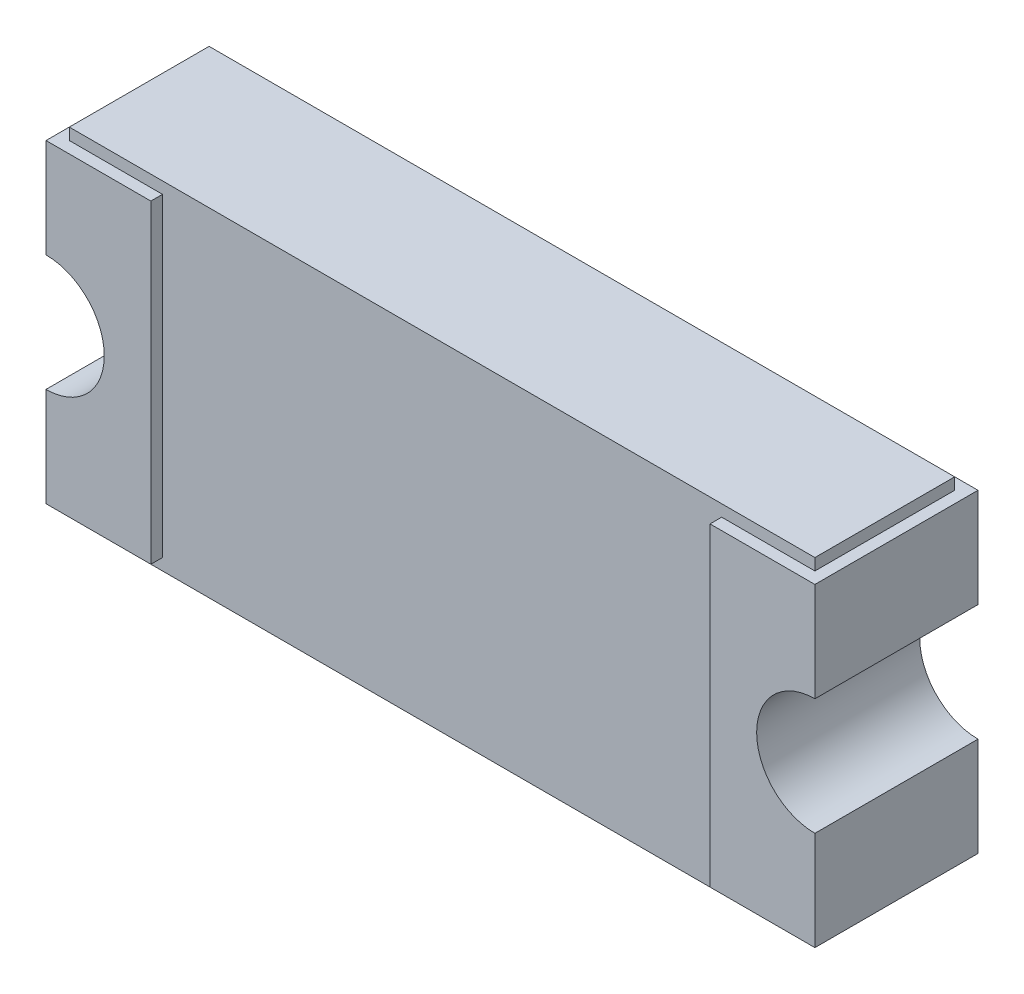
ISO-10303-21;
HEADER;
FILE_DESCRIPTION(('STEP AP214'),'2;1');
FILE_NAME('part.step','',(''),(''),'','','');
FILE_SCHEMA(('AUTOMOTIVE_DESIGN { 1 0 10303 214 1 1 1 1 }'));
ENDSEC;
DATA;
#1=APPLICATION_CONTEXT('core data for automotive mechanical design processes');
#2=APPLICATION_PROTOCOL_DEFINITION('international standard','automotive_design',2000,#1);
#3=PRODUCT_CONTEXT('',#1,'mechanical');
#4=PRODUCT('Part','Part','',(#3));
#5=PRODUCT_RELATED_PRODUCT_CATEGORY('part','',(#4));
#6=PRODUCT_DEFINITION_FORMATION('','',#4);
#7=PRODUCT_DEFINITION_CONTEXT('part definition',#1,'design');
#8=PRODUCT_DEFINITION('design','',#6,#7);
#9=PRODUCT_DEFINITION_SHAPE('','',#8);
#10=(LENGTH_UNIT() NAMED_UNIT(*) SI_UNIT(.MILLI.,.METRE.));
#11=(NAMED_UNIT(*) PLANE_ANGLE_UNIT() SI_UNIT($,.RADIAN.));
#12=(NAMED_UNIT(*) SI_UNIT($,.STERADIAN.) SOLID_ANGLE_UNIT());
#13=UNCERTAINTY_MEASURE_WITH_UNIT(LENGTH_MEASURE(1.E-05),#10,'distance_accuracy_value','');
#14=(GEOMETRIC_REPRESENTATION_CONTEXT(3) GLOBAL_UNCERTAINTY_ASSIGNED_CONTEXT((#13)) GLOBAL_UNIT_ASSIGNED_CONTEXT((#10,
#11,#12)) REPRESENTATION_CONTEXT('',''));
#15=CARTESIAN_POINT('',(0.,0.,0.));
#16=DIRECTION('',(0.,0.,1.));
#17=DIRECTION('',(1.,0.,0.));
#18=AXIS2_PLACEMENT_3D('',#15,#16,#17);
#19=CARTESIAN_POINT('',(-0.825,0.,0.35));
#20=DIRECTION('',(0.,0.,1.));
#21=DIRECTION('',(1.,0.,0.));
#22=AXIS2_PLACEMENT_3D('',#19,#20,#21);
#23=CYLINDRICAL_SURFACE('',#22,0.125);
#24=CARTESIAN_POINT('',(-0.825,0.,0.35));
#25=DIRECTION('',(0.,0.,1.));
#26=DIRECTION('',(1.,0.,0.));
#27=AXIS2_PLACEMENT_3D('',#24,#25,#26);
#28=CIRCLE('',#27,0.125);
#29=CARTESIAN_POINT('',(-0.825,-0.125,0.35));
#30=VERTEX_POINT('',#29);
#31=CARTESIAN_POINT('',(-0.825,0.125,0.35));
#32=VERTEX_POINT('',#31);
#33=EDGE_CURVE('E191',#30,#32,#28,.T.);
#34=ORIENTED_EDGE('',*,*,#33,.T.);
#35=DIRECTION('',(0.,0.,1.));
#36=VECTOR('',#35,1.);
#37=CARTESIAN_POINT('',(-0.825,0.125,0.));
#38=LINE('',#37,#36);
#39=CARTESIAN_POINT('',(-0.825,0.125,0.));
#40=VERTEX_POINT('',#39);
#41=EDGE_CURVE('E175',#40,#32,#38,.T.);
#42=ORIENTED_EDGE('',*,*,#41,.F.);
#43=CARTESIAN_POINT('',(-0.825,0.,0.));
#44=DIRECTION('',(0.,0.,1.));
#45=DIRECTION('',(1.,0.,0.));
#46=AXIS2_PLACEMENT_3D('',#43,#44,#45);
#47=CIRCLE('',#46,0.125);
#48=CARTESIAN_POINT('',(-0.825,-0.125,0.));
#49=VERTEX_POINT('',#48);
#50=EDGE_CURVE('E20',#40,#49,#47,.F.);
#51=ORIENTED_EDGE('',*,*,#50,.T.);
#52=DIRECTION('',(0.,0.,1.));
#53=VECTOR('',#52,1.);
#54=CARTESIAN_POINT('',(-0.825,-0.125,0.));
#55=LINE('',#54,#53);
#56=EDGE_CURVE('E179',#30,#49,#55,.F.);
#57=ORIENTED_EDGE('',*,*,#56,.F.);
#58=EDGE_LOOP('',(#34,#42,#51,#57));
#59=FACE_BOUND('',#58,.T.);
#60=ADVANCED_FACE('F17',(#59),#23,.F.);
#61=CARTESIAN_POINT('',(0.825,0.,0.35));
#62=DIRECTION('',(0.,0.,1.));
#63=DIRECTION('',(1.,0.,0.));
#64=AXIS2_PLACEMENT_3D('',#61,#62,#63);
#65=CYLINDRICAL_SURFACE('',#64,0.125);
#66=CARTESIAN_POINT('',(0.825,0.,0.35));
#67=DIRECTION('',(0.,0.,1.));
#68=DIRECTION('',(1.,0.,0.));
#69=AXIS2_PLACEMENT_3D('',#66,#67,#68);
#70=CIRCLE('',#69,0.125);
#71=CARTESIAN_POINT('',(0.825,0.125,0.35));
#72=VERTEX_POINT('',#71);
#73=CARTESIAN_POINT('',(0.825,-0.125,0.35));
#74=VERTEX_POINT('',#73);
#75=EDGE_CURVE('E311',#72,#74,#70,.T.);
#76=ORIENTED_EDGE('',*,*,#75,.T.);
#77=DIRECTION('',(0.,0.,-1.));
#78=VECTOR('',#77,1.);
#79=CARTESIAN_POINT('',(0.825,-0.125,0.));
#80=LINE('',#79,#78);
#81=CARTESIAN_POINT('',(0.825,-0.125,0.));
#82=VERTEX_POINT('',#81);
#83=EDGE_CURVE('E291',#82,#74,#80,.F.);
#84=ORIENTED_EDGE('',*,*,#83,.F.);
#85=CARTESIAN_POINT('',(0.825,0.,0.));
#86=DIRECTION('',(0.,0.,1.));
#87=DIRECTION('',(1.,0.,0.));
#88=AXIS2_PLACEMENT_3D('',#85,#86,#87);
#89=CIRCLE('',#88,0.125);
#90=CARTESIAN_POINT('',(0.825,0.125,0.));
#91=VERTEX_POINT('',#90);
#92=EDGE_CURVE('E336',#82,#91,#89,.F.);
#93=ORIENTED_EDGE('',*,*,#92,.T.);
#94=DIRECTION('',(0.,0.,-1.));
#95=VECTOR('',#94,1.);
#96=CARTESIAN_POINT('',(0.825,0.125,0.));
#97=LINE('',#96,#95);
#98=EDGE_CURVE('E308',#72,#91,#97,.T.);
#99=ORIENTED_EDGE('',*,*,#98,.F.);
#100=EDGE_LOOP('',(#76,#84,#93,#99));
#101=FACE_BOUND('',#100,.T.);
#102=ADVANCED_FACE('F563',(#101),#65,.F.);
#103=CARTESIAN_POINT('',(-0.825,0.3625,0.));
#104=DIRECTION('',(-1.,0.,0.));
#105=DIRECTION('',(0.,0.,1.));
#106=AXIS2_PLACEMENT_3D('',#103,#104,#105);
#107=PLANE('',#106);
#108=DIRECTION('',(0.,1.,0.));
#109=VECTOR('',#108,1.);
#110=CARTESIAN_POINT('',(-0.825,0.,0.));
#111=LINE('',#110,#109);
#112=CARTESIAN_POINT('',(-0.825,0.3375,0.));
#113=VERTEX_POINT('',#112);
#114=EDGE_CURVE('E185',#113,#40,#111,.F.);
#115=ORIENTED_EDGE('',*,*,#114,.T.);
#116=ORIENTED_EDGE('',*,*,#41,.T.);
#117=DIRECTION('',(0.,1.,0.));
#118=VECTOR('',#117,1.);
#119=CARTESIAN_POINT('',(-0.825,-0.3625,0.35));
#120=LINE('',#119,#118);
#121=CARTESIAN_POINT('',(-0.825,0.3375,0.35));
#122=VERTEX_POINT('',#121);
#123=EDGE_CURVE('E372',#32,#122,#120,.T.);
#124=ORIENTED_EDGE('',*,*,#123,.T.);
#125=DIRECTION('',(0.,0.,-1.));
#126=VECTOR('',#125,1.);
#127=CARTESIAN_POINT('',(-0.825,0.3375,0.68));
#128=LINE('',#127,#126);
#129=EDGE_CURVE('E229',#122,#113,#128,.T.);
#130=ORIENTED_EDGE('',*,*,#129,.T.);
#131=EDGE_LOOP('',(#115,#116,#124,#130));
#132=FACE_BOUND('',#131,.T.);
#133=ADVANCED_FACE('F561',(#132),#107,.T.);
#134=CARTESIAN_POINT('',(0.,0.,0.));
#135=DIRECTION('',(0.,0.,1.));
#136=DIRECTION('',(1.,0.,0.));
#137=AXIS2_PLACEMENT_3D('',#134,#135,#136);
#138=PLANE('',#137);
#139=ORIENTED_EDGE('',*,*,#50,.F.);
#140=ORIENTED_EDGE('',*,*,#114,.F.);
#141=DIRECTION('',(1.,0.,0.));
#142=VECTOR('',#141,1.);
#143=CARTESIAN_POINT('',(0.575,0.3375,0.));
#144=LINE('',#143,#142);
#145=CARTESIAN_POINT('',(-0.6,0.3375,0.));
#146=VERTEX_POINT('',#145);
#147=EDGE_CURVE('E225',#113,#146,#144,.T.);
#148=ORIENTED_EDGE('',*,*,#147,.T.);
#149=DIRECTION('',(0.,1.,0.));
#150=VECTOR('',#149,1.);
#151=CARTESIAN_POINT('',(-0.6,-0.3625,0.));
#152=LINE('',#151,#150);
#153=CARTESIAN_POINT('',(-0.6,-0.3375,0.));
#154=VERTEX_POINT('',#153);
#155=EDGE_CURVE('E206',#146,#154,#152,.F.);
#156=ORIENTED_EDGE('',*,*,#155,.T.);
#157=DIRECTION('',(1.,0.,0.));
#158=VECTOR('',#157,1.);
#159=CARTESIAN_POINT('',(0.825,-0.3375,0.));
#160=LINE('',#159,#158);
#161=CARTESIAN_POINT('',(-0.825,-0.3375,0.));
#162=VERTEX_POINT('',#161);
#163=EDGE_CURVE('E196',#154,#162,#160,.F.);
#164=ORIENTED_EDGE('',*,*,#163,.T.);
#165=DIRECTION('',(0.,1.,0.));
#166=VECTOR('',#165,1.);
#167=CARTESIAN_POINT('',(-0.825,0.3625,0.));
#168=LINE('',#167,#166);
#169=EDGE_CURVE('E184',#49,#162,#168,.F.);
#170=ORIENTED_EDGE('',*,*,#169,.F.);
#171=EDGE_LOOP('',(#139,#140,#148,#156,#164,#170));
#172=FACE_BOUND('',#171,.T.);
#173=ADVANCED_FACE('F194',(#172),#138,.F.);
#174=CARTESIAN_POINT('',(-0.825,0.3625,0.));
#175=DIRECTION('',(-1.,0.,0.));
#176=DIRECTION('',(0.,0.,1.));
#177=AXIS2_PLACEMENT_3D('',#174,#175,#176);
#178=PLANE('',#177);
#179=DIRECTION('',(0.,1.,0.));
#180=VECTOR('',#179,1.);
#181=CARTESIAN_POINT('',(-0.825,-0.3625,0.35));
#182=LINE('',#181,#180);
#183=CARTESIAN_POINT('',(-0.825,-0.3375,0.35));
#184=VERTEX_POINT('',#183);
#185=EDGE_CURVE('E190',#184,#30,#182,.T.);
#186=ORIENTED_EDGE('',*,*,#185,.T.);
#187=ORIENTED_EDGE('',*,*,#56,.T.);
#188=ORIENTED_EDGE('',*,*,#169,.T.);
#189=DIRECTION('',(0.,0.,1.));
#190=VECTOR('',#189,1.);
#191=CARTESIAN_POINT('',(-0.825,-0.3375,0.68));
#192=LINE('',#191,#190);
#193=EDGE_CURVE('E205',#162,#184,#192,.T.);
#194=ORIENTED_EDGE('',*,*,#193,.T.);
#195=EDGE_LOOP('',(#186,#187,#188,#194));
#196=FACE_BOUND('',#195,.T.);
#197=ADVANCED_FACE('F187',(#196),#178,.T.);
#198=CARTESIAN_POINT('',(-0.825,-0.3625,0.35));
#199=DIRECTION('',(0.,0.,-1.));
#200=DIRECTION('',(-1.,0.,0.));
#201=AXIS2_PLACEMENT_3D('',#198,#199,#200);
#202=PLANE('',#201);
#203=DIRECTION('',(1.,0.,0.));
#204=VECTOR('',#203,1.);
#205=CARTESIAN_POINT('',(0.825,-0.3375,0.35));
#206=LINE('',#205,#204);
#207=CARTESIAN_POINT('',(-0.6,-0.3375,0.35));
#208=VERTEX_POINT('',#207);
#209=EDGE_CURVE('E382',#184,#208,#206,.T.);
#210=ORIENTED_EDGE('',*,*,#209,.T.);
#211=DIRECTION('',(0.,1.,0.));
#212=VECTOR('',#211,1.);
#213=CARTESIAN_POINT('',(-0.6,-0.3625,0.35));
#214=LINE('',#213,#212);
#215=CARTESIAN_POINT('',(-0.6,0.3375,0.35));
#216=VERTEX_POINT('',#215);
#217=EDGE_CURVE('E371',#208,#216,#214,.T.);
#218=ORIENTED_EDGE('',*,*,#217,.T.);
#219=DIRECTION('',(1.,0.,0.));
#220=VECTOR('',#219,1.);
#221=CARTESIAN_POINT('',(0.575,0.3375,0.35));
#222=LINE('',#221,#220);
#223=EDGE_CURVE('E246',#216,#122,#222,.F.);
#224=ORIENTED_EDGE('',*,*,#223,.T.);
#225=ORIENTED_EDGE('',*,*,#123,.F.);
#226=ORIENTED_EDGE('',*,*,#33,.F.);
#227=ORIENTED_EDGE('',*,*,#185,.F.);
#228=EDGE_LOOP('',(#210,#218,#224,#225,#226,#227));
#229=FACE_BOUND('',#228,.T.);
#230=ADVANCED_FACE('F553',(#229),#202,.F.);
#231=CARTESIAN_POINT('',(-0.6,-0.3625,0.35));
#232=DIRECTION('',(-1.,0.,0.));
#233=DIRECTION('',(0.,0.,1.));
#234=AXIS2_PLACEMENT_3D('',#231,#232,#233);
#235=PLANE('',#234);
#236=DIRECTION('',(0.,0.,1.));
#237=VECTOR('',#236,1.);
#238=CARTESIAN_POINT('',(-0.6,-0.3375,0.68));
#239=LINE('',#238,#237);
#240=CARTESIAN_POINT('',(-0.6,-0.3375,0.325));
#241=VERTEX_POINT('',#240);
#242=EDGE_CURVE('E357',#208,#241,#239,.F.);
#243=ORIENTED_EDGE('',*,*,#242,.T.);
#244=DIRECTION('',(0.,1.,0.));
#245=VECTOR('',#244,1.);
#246=CARTESIAN_POINT('',(-0.6,-0.3625,0.325));
#247=LINE('',#246,#245);
#248=CARTESIAN_POINT('',(-0.6,0.3375,0.325));
#249=VERTEX_POINT('',#248);
#250=EDGE_CURVE('E292',#241,#249,#247,.T.);
#251=ORIENTED_EDGE('',*,*,#250,.T.);
#252=DIRECTION('',(0.,0.,-1.));
#253=VECTOR('',#252,1.);
#254=CARTESIAN_POINT('',(-0.6,0.3375,0.68));
#255=LINE('',#254,#253);
#256=EDGE_CURVE('E251',#249,#216,#255,.F.);
#257=ORIENTED_EDGE('',*,*,#256,.T.);
#258=ORIENTED_EDGE('',*,*,#217,.F.);
#259=EDGE_LOOP('',(#243,#251,#257,#258));
#260=FACE_BOUND('',#259,.T.);
#261=ADVANCED_FACE('F549',(#260),#235,.F.);
#262=CARTESIAN_POINT('',(-0.6,-0.3625,0.325));
#263=DIRECTION('',(0.,0.,-1.));
#264=DIRECTION('',(-1.,0.,0.));
#265=AXIS2_PLACEMENT_3D('',#262,#263,#264);
#266=PLANE('',#265);
#267=DIRECTION('',(1.,0.,0.));
#268=VECTOR('',#267,1.);
#269=CARTESIAN_POINT('',(0.825,0.3625,0.325));
#270=LINE('',#269,#268);
#271=CARTESIAN_POINT('',(-0.8,0.3625,0.325));
#272=VERTEX_POINT('',#271);
#273=CARTESIAN_POINT('',(0.8,0.3625,0.325));
#274=VERTEX_POINT('',#273);
#275=EDGE_CURVE('E276',#272,#274,#270,.T.);
#276=ORIENTED_EDGE('',*,*,#275,.F.);
#277=DIRECTION('',(0.,1.,0.));
#278=VECTOR('',#277,1.);
#279=CARTESIAN_POINT('',(-0.8,0.3375,0.325));
#280=LINE('',#279,#278);
#281=CARTESIAN_POINT('',(-0.8,0.3375,0.325));
#282=VERTEX_POINT('',#281);
#283=EDGE_CURVE('E262',#272,#282,#280,.F.);
#284=ORIENTED_EDGE('',*,*,#283,.T.);
#285=DIRECTION('',(-1.,0.,0.));
#286=VECTOR('',#285,1.);
#287=CARTESIAN_POINT('',(-0.6,0.3375,0.325));
#288=LINE('',#287,#286);
#289=EDGE_CURVE('E256',#282,#249,#288,.F.);
#290=ORIENTED_EDGE('',*,*,#289,.T.);
#291=ORIENTED_EDGE('',*,*,#250,.F.);
#292=DIRECTION('',(-1.,0.,0.));
#293=VECTOR('',#292,1.);
#294=CARTESIAN_POINT('',(-0.6,-0.3375,0.325));
#295=LINE('',#294,#293);
#296=CARTESIAN_POINT('',(-0.8,-0.3375,0.325));
#297=VERTEX_POINT('',#296);
#298=EDGE_CURVE('E220',#241,#297,#295,.T.);
#299=ORIENTED_EDGE('',*,*,#298,.T.);
#300=DIRECTION('',(0.,1.,0.));
#301=VECTOR('',#300,1.);
#302=CARTESIAN_POINT('',(-0.8,-0.3625,0.325));
#303=LINE('',#302,#301);
#304=CARTESIAN_POINT('',(-0.8,-0.3625,0.325));
#305=VERTEX_POINT('',#304);
#306=EDGE_CURVE('E399',#297,#305,#303,.F.);
#307=ORIENTED_EDGE('',*,*,#306,.T.);
#308=DIRECTION('',(1.,0.,0.));
#309=VECTOR('',#308,1.);
#310=CARTESIAN_POINT('',(-0.825,-0.3625,0.325));
#311=LINE('',#310,#309);
#312=CARTESIAN_POINT('',(0.8,-0.3625,0.325));
#313=VERTEX_POINT('',#312);
#314=EDGE_CURVE('E402',#313,#305,#311,.F.);
#315=ORIENTED_EDGE('',*,*,#314,.F.);
#316=DIRECTION('',(0.,1.,0.));
#317=VECTOR('',#316,1.);
#318=CARTESIAN_POINT('',(0.8,-0.3625,0.325));
#319=LINE('',#318,#317);
#320=CARTESIAN_POINT('',(0.8,-0.3375,0.325));
#321=VERTEX_POINT('',#320);
#322=EDGE_CURVE('E350',#321,#313,#319,.F.);
#323=ORIENTED_EDGE('',*,*,#322,.F.);
#324=DIRECTION('',(1.,0.,0.));
#325=VECTOR('',#324,1.);
#326=CARTESIAN_POINT('',(0.825,-0.3375,0.325));
#327=LINE('',#326,#325);
#328=CARTESIAN_POINT('',(0.6,-0.3375,0.325));
#329=VERTEX_POINT('',#328);
#330=EDGE_CURVE('E352',#329,#321,#327,.T.);
#331=ORIENTED_EDGE('',*,*,#330,.F.);
#332=DIRECTION('',(0.,1.,0.));
#333=VECTOR('',#332,1.);
#334=CARTESIAN_POINT('',(0.6,-0.3625,0.325));
#335=LINE('',#334,#333);
#336=CARTESIAN_POINT('',(0.6,0.3375,0.325));
#337=VERTEX_POINT('',#336);
#338=EDGE_CURVE('E281',#329,#337,#335,.T.);
#339=ORIENTED_EDGE('',*,*,#338,.T.);
#340=DIRECTION('',(1.,0.,0.));
#341=VECTOR('',#340,1.);
#342=CARTESIAN_POINT('',(0.575,0.3375,0.325));
#343=LINE('',#342,#341);
#344=CARTESIAN_POINT('',(0.8,0.3375,0.325));
#345=VERTEX_POINT('',#344);
#346=EDGE_CURVE('E370',#345,#337,#343,.F.);
#347=ORIENTED_EDGE('',*,*,#346,.F.);
#348=DIRECTION('',(0.,1.,0.));
#349=VECTOR('',#348,1.);
#350=CARTESIAN_POINT('',(0.8,-0.3625,0.325));
#351=LINE('',#350,#349);
#352=EDGE_CURVE('E289',#274,#345,#351,.F.);
#353=ORIENTED_EDGE('',*,*,#352,.F.);
#354=EDGE_LOOP('',(#276,#284,#290,#291,#299,#307,#315,#323,#331,#339,#347,#353));
#355=FACE_BOUND('',#354,.T.);
#356=ADVANCED_FACE('F545',(#355),#266,.F.);
#357=CARTESIAN_POINT('',(0.825,-0.3625,0.));
#358=DIRECTION('',(1.,0.,0.));
#359=DIRECTION('',(0.,0.,-1.));
#360=AXIS2_PLACEMENT_3D('',#357,#358,#359);
#361=PLANE('',#360);
#362=DIRECTION('',(0.,1.,0.));
#363=VECTOR('',#362,1.);
#364=CARTESIAN_POINT('',(0.825,0.,0.));
#365=LINE('',#364,#363);
#366=CARTESIAN_POINT('',(0.825,-0.3375,0.));
#367=VERTEX_POINT('',#366);
#368=EDGE_CURVE('E324',#367,#82,#365,.T.);
#369=ORIENTED_EDGE('',*,*,#368,.T.);
#370=ORIENTED_EDGE('',*,*,#83,.T.);
#371=DIRECTION('',(0.,1.,0.));
#372=VECTOR('',#371,1.);
#373=CARTESIAN_POINT('',(0.825,-0.3625,0.35));
#374=LINE('',#373,#372);
#375=CARTESIAN_POINT('',(0.825,-0.3375,0.35));
#376=VERTEX_POINT('',#375);
#377=EDGE_CURVE('E365',#74,#376,#374,.F.);
#378=ORIENTED_EDGE('',*,*,#377,.T.);
#379=DIRECTION('',(0.,0.,1.));
#380=VECTOR('',#379,1.);
#381=CARTESIAN_POINT('',(0.825,-0.3375,0.68));
#382=LINE('',#381,#380);
#383=EDGE_CURVE('E325',#376,#367,#382,.F.);
#384=ORIENTED_EDGE('',*,*,#383,.T.);
#385=EDGE_LOOP('',(#369,#370,#378,#384));
#386=FACE_BOUND('',#385,.T.);
#387=ADVANCED_FACE('F541',(#386),#361,.T.);
#388=CARTESIAN_POINT('',(0.,0.,0.));
#389=DIRECTION('',(0.,0.,1.));
#390=DIRECTION('',(1.,0.,0.));
#391=AXIS2_PLACEMENT_3D('',#388,#389,#390);
#392=PLANE('',#391);
#393=DIRECTION('',(1.,0.,0.));
#394=VECTOR('',#393,1.);
#395=CARTESIAN_POINT('',(0.575,0.3375,0.));
#396=LINE('',#395,#394);
#397=CARTESIAN_POINT('',(0.6,0.3375,0.));
#398=VERTEX_POINT('',#397);
#399=CARTESIAN_POINT('',(0.825,0.3375,0.));
#400=VERTEX_POINT('',#399);
#401=EDGE_CURVE('E320',#398,#400,#396,.T.);
#402=ORIENTED_EDGE('',*,*,#401,.T.);
#403=DIRECTION('',(0.,1.,0.));
#404=VECTOR('',#403,1.);
#405=CARTESIAN_POINT('',(0.825,-0.3625,0.));
#406=LINE('',#405,#404);
#407=EDGE_CURVE('E312',#91,#400,#406,.T.);
#408=ORIENTED_EDGE('',*,*,#407,.F.);
#409=ORIENTED_EDGE('',*,*,#92,.F.);
#410=ORIENTED_EDGE('',*,*,#368,.F.);
#411=DIRECTION('',(1.,0.,0.));
#412=VECTOR('',#411,1.);
#413=CARTESIAN_POINT('',(0.825,-0.3375,0.));
#414=LINE('',#413,#412);
#415=CARTESIAN_POINT('',(0.6,-0.3375,0.));
#416=VERTEX_POINT('',#415);
#417=EDGE_CURVE('E344',#367,#416,#414,.F.);
#418=ORIENTED_EDGE('',*,*,#417,.T.);
#419=DIRECTION('',(0.,1.,0.));
#420=VECTOR('',#419,1.);
#421=CARTESIAN_POINT('',(0.6,-0.3625,0.));
#422=LINE('',#421,#420);
#423=EDGE_CURVE('E423',#416,#398,#422,.T.);
#424=ORIENTED_EDGE('',*,*,#423,.T.);
#425=EDGE_LOOP('',(#402,#408,#409,#410,#418,#424));
#426=FACE_BOUND('',#425,.T.);
#427=ADVANCED_FACE('F537',(#426),#392,.F.);
#428=CARTESIAN_POINT('',(0.825,-0.3625,0.));
#429=DIRECTION('',(1.,0.,0.));
#430=DIRECTION('',(0.,0.,-1.));
#431=AXIS2_PLACEMENT_3D('',#428,#429,#430);
#432=PLANE('',#431);
#433=DIRECTION('',(0.,1.,0.));
#434=VECTOR('',#433,1.);
#435=CARTESIAN_POINT('',(0.825,-0.3625,0.35));
#436=LINE('',#435,#434);
#437=CARTESIAN_POINT('',(0.825,0.3375,0.35));
#438=VERTEX_POINT('',#437);
#439=EDGE_CURVE('E410',#438,#72,#436,.F.);
#440=ORIENTED_EDGE('',*,*,#439,.T.);
#441=ORIENTED_EDGE('',*,*,#98,.T.);
#442=ORIENTED_EDGE('',*,*,#407,.T.);
#443=DIRECTION('',(0.,0.,-1.));
#444=VECTOR('',#443,1.);
#445=CARTESIAN_POINT('',(0.825,0.3375,0.68));
#446=LINE('',#445,#444);
#447=EDGE_CURVE('E315',#400,#438,#446,.F.);
#448=ORIENTED_EDGE('',*,*,#447,.T.);
#449=EDGE_LOOP('',(#440,#441,#442,#448));
#450=FACE_BOUND('',#449,.T.);
#451=ADVANCED_FACE('F533',(#450),#432,.T.);
#452=CARTESIAN_POINT('',(0.6,-0.3625,0.35));
#453=DIRECTION('',(0.,0.,-1.));
#454=DIRECTION('',(-1.,0.,0.));
#455=AXIS2_PLACEMENT_3D('',#452,#453,#454);
#456=PLANE('',#455);
#457=DIRECTION('',(1.,0.,0.));
#458=VECTOR('',#457,1.);
#459=CARTESIAN_POINT('',(0.575,0.3375,0.35));
#460=LINE('',#459,#458);
#461=CARTESIAN_POINT('',(0.6,0.3375,0.35));
#462=VERTEX_POINT('',#461);
#463=EDGE_CURVE('E307',#438,#462,#460,.F.);
#464=ORIENTED_EDGE('',*,*,#463,.T.);
#465=DIRECTION('',(0.,1.,0.));
#466=VECTOR('',#465,1.);
#467=CARTESIAN_POINT('',(0.6,-0.3625,0.35));
#468=LINE('',#467,#466);
#469=CARTESIAN_POINT('',(0.6,-0.3375,0.35));
#470=VERTEX_POINT('',#469);
#471=EDGE_CURVE('E362',#462,#470,#468,.F.);
#472=ORIENTED_EDGE('',*,*,#471,.T.);
#473=DIRECTION('',(1.,0.,0.));
#474=VECTOR('',#473,1.);
#475=CARTESIAN_POINT('',(0.825,-0.3375,0.35));
#476=LINE('',#475,#474);
#477=EDGE_CURVE('E302',#470,#376,#476,.T.);
#478=ORIENTED_EDGE('',*,*,#477,.T.);
#479=ORIENTED_EDGE('',*,*,#377,.F.);
#480=ORIENTED_EDGE('',*,*,#75,.F.);
#481=ORIENTED_EDGE('',*,*,#439,.F.);
#482=EDGE_LOOP('',(#464,#472,#478,#479,#480,#481));
#483=FACE_BOUND('',#482,.T.);
#484=ADVANCED_FACE('F529',(#483),#456,.F.);
#485=CARTESIAN_POINT('',(0.6,-0.3625,0.325));
#486=DIRECTION('',(1.,0.,0.));
#487=DIRECTION('',(0.,0.,-1.));
#488=AXIS2_PLACEMENT_3D('',#485,#486,#487);
#489=PLANE('',#488);
#490=DIRECTION('',(0.,0.,1.));
#491=VECTOR('',#490,1.);
#492=CARTESIAN_POINT('',(0.6,-0.3375,0.68));
#493=LINE('',#492,#491);
#494=EDGE_CURVE('E299',#329,#470,#493,.T.);
#495=ORIENTED_EDGE('',*,*,#494,.T.);
#496=ORIENTED_EDGE('',*,*,#471,.F.);
#497=DIRECTION('',(0.,0.,-1.));
#498=VECTOR('',#497,1.);
#499=CARTESIAN_POINT('',(0.6,0.3375,0.68));
#500=LINE('',#499,#498);
#501=EDGE_CURVE('E304',#462,#337,#500,.T.);
#502=ORIENTED_EDGE('',*,*,#501,.T.);
#503=ORIENTED_EDGE('',*,*,#338,.F.);
#504=EDGE_LOOP('',(#495,#496,#502,#503));
#505=FACE_BOUND('',#504,.T.);
#506=ADVANCED_FACE('F526',(#505),#489,.F.);
#507=CARTESIAN_POINT('',(0.825,0.3625,0.));
#508=DIRECTION('',(0.,1.,0.));
#509=DIRECTION('',(0.,0.,1.));
#510=AXIS2_PLACEMENT_3D('',#507,#508,#509);
#511=PLANE('',#510);
#512=DIRECTION('',(0.,0.,1.));
#513=VECTOR('',#512,1.);
#514=CARTESIAN_POINT('',(0.8,0.3625,0.35));
#515=LINE('',#514,#513);
#516=CARTESIAN_POINT('',(0.8,0.3625,0.025));
#517=VERTEX_POINT('',#516);
#518=EDGE_CURVE('E286',#274,#517,#515,.F.);
#519=ORIENTED_EDGE('',*,*,#518,.T.);
#520=DIRECTION('',(1.,0.,0.));
#521=VECTOR('',#520,1.);
#522=CARTESIAN_POINT('',(0.6,0.3625,0.025));
#523=LINE('',#522,#521);
#524=CARTESIAN_POINT('',(-0.8,0.3625,0.025));
#525=VERTEX_POINT('',#524);
#526=EDGE_CURVE('E271',#517,#525,#523,.F.);
#527=ORIENTED_EDGE('',*,*,#526,.T.);
#528=DIRECTION('',(0.,0.,-1.));
#529=VECTOR('',#528,1.);
#530=CARTESIAN_POINT('',(-0.8,0.3625,0.35));
#531=LINE('',#530,#529);
#532=EDGE_CURVE('E266',#525,#272,#531,.F.);
#533=ORIENTED_EDGE('',*,*,#532,.T.);
#534=ORIENTED_EDGE('',*,*,#275,.T.);
#535=EDGE_LOOP('',(#519,#527,#533,#534));
#536=FACE_BOUND('',#535,.T.);
#537=ADVANCED_FACE('F493',(#536),#511,.T.);
#538=CARTESIAN_POINT('',(-0.8,0.3375,0.35));
#539=DIRECTION('',(1.,0.,0.));
#540=DIRECTION('',(0.,0.,-1.));
#541=AXIS2_PLACEMENT_3D('',#538,#539,#540);
#542=PLANE('',#541);
#543=ORIENTED_EDGE('',*,*,#283,.F.);
#544=ORIENTED_EDGE('',*,*,#532,.F.);
#545=DIRECTION('',(0.,1.,0.));
#546=VECTOR('',#545,1.);
#547=CARTESIAN_POINT('',(-0.8,-0.3625,0.025));
#548=LINE('',#547,#546);
#549=CARTESIAN_POINT('',(-0.8,0.3375,0.025));
#550=VERTEX_POINT('',#549);
#551=EDGE_CURVE('E241',#525,#550,#548,.F.);
#552=ORIENTED_EDGE('',*,*,#551,.T.);
#553=DIRECTION('',(0.,0.,-1.));
#554=VECTOR('',#553,1.);
#555=CARTESIAN_POINT('',(-0.8,0.3375,0.68));
#556=LINE('',#555,#554);
#557=EDGE_CURVE('E259',#550,#282,#556,.F.);
#558=ORIENTED_EDGE('',*,*,#557,.T.);
#559=EDGE_LOOP('',(#543,#544,#552,#558));
#560=FACE_BOUND('',#559,.T.);
#561=ADVANCED_FACE('F491',(#560),#542,.F.);
#562=CARTESIAN_POINT('',(0.575,0.3375,0.68));
#563=DIRECTION('',(0.,-1.,0.));
#564=DIRECTION('',(0.,0.,-1.));
#565=AXIS2_PLACEMENT_3D('',#562,#563,#564);
#566=PLANE('',#565);
#567=ORIENTED_EDGE('',*,*,#147,.F.);
#568=ORIENTED_EDGE('',*,*,#129,.F.);
#569=ORIENTED_EDGE('',*,*,#223,.F.);
#570=ORIENTED_EDGE('',*,*,#256,.F.);
#571=ORIENTED_EDGE('',*,*,#289,.F.);
#572=ORIENTED_EDGE('',*,*,#557,.F.);
#573=DIRECTION('',(1.,0.,0.));
#574=VECTOR('',#573,1.);
#575=CARTESIAN_POINT('',(0.6,0.3375,0.025));
#576=LINE('',#575,#574);
#577=CARTESIAN_POINT('',(-0.6,0.3375,0.025));
#578=VERTEX_POINT('',#577);
#579=EDGE_CURVE('E236',#550,#578,#576,.T.);
#580=ORIENTED_EDGE('',*,*,#579,.T.);
#581=DIRECTION('',(0.,0.,1.));
#582=VECTOR('',#581,1.);
#583=CARTESIAN_POINT('',(-0.6,0.3375,0.025));
#584=LINE('',#583,#582);
#585=EDGE_CURVE('E213',#578,#146,#584,.F.);
#586=ORIENTED_EDGE('',*,*,#585,.T.);
#587=EDGE_LOOP('',(#567,#568,#569,#570,#571,#572,#580,#586));
#588=FACE_BOUND('',#587,.T.);
#589=ADVANCED_FACE('F486',(#588),#566,.F.);
#590=CARTESIAN_POINT('',(-0.6,-0.3625,0.025));
#591=DIRECTION('',(-1.,0.,0.));
#592=DIRECTION('',(0.,0.,1.));
#593=AXIS2_PLACEMENT_3D('',#590,#591,#592);
#594=PLANE('',#593);
#595=ORIENTED_EDGE('',*,*,#585,.F.);
#596=DIRECTION('',(0.,1.,0.));
#597=VECTOR('',#596,1.);
#598=CARTESIAN_POINT('',(-0.6,-0.3625,0.025));
#599=LINE('',#598,#597);
#600=CARTESIAN_POINT('',(-0.6,-0.3375,0.025));
#601=VERTEX_POINT('',#600);
#602=EDGE_CURVE('E232',#578,#601,#599,.F.);
#603=ORIENTED_EDGE('',*,*,#602,.T.);
#604=DIRECTION('',(0.,0.,1.));
#605=VECTOR('',#604,1.);
#606=CARTESIAN_POINT('',(-0.6,-0.3375,0.68));
#607=LINE('',#606,#605);
#608=EDGE_CURVE('E216',#601,#154,#607,.F.);
#609=ORIENTED_EDGE('',*,*,#608,.T.);
#610=ORIENTED_EDGE('',*,*,#155,.F.);
#611=EDGE_LOOP('',(#595,#603,#609,#610));
#612=FACE_BOUND('',#611,.T.);
#613=ADVANCED_FACE('F482',(#612),#594,.F.);
#614=CARTESIAN_POINT('',(0.825,-0.3375,0.68));
#615=DIRECTION('',(0.,1.,0.));
#616=DIRECTION('',(0.,0.,1.));
#617=AXIS2_PLACEMENT_3D('',#614,#615,#616);
#618=PLANE('',#617);
#619=DIRECTION('',(1.,0.,0.));
#620=VECTOR('',#619,1.);
#621=CARTESIAN_POINT('',(0.6,-0.3375,0.025));
#622=LINE('',#621,#620);
#623=CARTESIAN_POINT('',(-0.8,-0.3375,0.025));
#624=VERTEX_POINT('',#623);
#625=EDGE_CURVE('E235',#601,#624,#622,.F.);
#626=ORIENTED_EDGE('',*,*,#625,.T.);
#627=DIRECTION('',(0.,0.,-1.));
#628=VECTOR('',#627,1.);
#629=CARTESIAN_POINT('',(-0.8,-0.3375,0.35));
#630=LINE('',#629,#628);
#631=EDGE_CURVE('E219',#624,#297,#630,.F.);
#632=ORIENTED_EDGE('',*,*,#631,.T.);
#633=ORIENTED_EDGE('',*,*,#298,.F.);
#634=ORIENTED_EDGE('',*,*,#242,.F.);
#635=ORIENTED_EDGE('',*,*,#209,.F.);
#636=ORIENTED_EDGE('',*,*,#193,.F.);
#637=ORIENTED_EDGE('',*,*,#163,.F.);
#638=ORIENTED_EDGE('',*,*,#608,.F.);
#639=EDGE_LOOP('',(#626,#632,#633,#634,#635,#636,#637,#638));
#640=FACE_BOUND('',#639,.T.);
#641=ADVANCED_FACE('F477',(#640),#618,.F.);
#642=CARTESIAN_POINT('',(-0.8,-0.3625,0.35));
#643=DIRECTION('',(1.,0.,0.));
#644=DIRECTION('',(0.,0.,-1.));
#645=AXIS2_PLACEMENT_3D('',#642,#643,#644);
#646=PLANE('',#645);
#647=ORIENTED_EDGE('',*,*,#306,.F.);
#648=ORIENTED_EDGE('',*,*,#631,.F.);
#649=DIRECTION('',(0.,1.,0.));
#650=VECTOR('',#649,1.);
#651=CARTESIAN_POINT('',(-0.8,-0.3625,0.025));
#652=LINE('',#651,#650);
#653=CARTESIAN_POINT('',(-0.8,-0.3625,0.025));
#654=VERTEX_POINT('',#653);
#655=EDGE_CURVE('E429',#624,#654,#652,.F.);
#656=ORIENTED_EDGE('',*,*,#655,.T.);
#657=DIRECTION('',(0.,0.,-1.));
#658=VECTOR('',#657,1.);
#659=CARTESIAN_POINT('',(-0.8,-0.3625,0.));
#660=LINE('',#659,#658);
#661=EDGE_CURVE('E417',#305,#654,#660,.T.);
#662=ORIENTED_EDGE('',*,*,#661,.F.);
#663=EDGE_LOOP('',(#647,#648,#656,#662));
#664=FACE_BOUND('',#663,.T.);
#665=ADVANCED_FACE('F474',(#664),#646,.F.);
#666=CARTESIAN_POINT('',(-0.825,-0.3625,0.));
#667=DIRECTION('',(0.,-1.,0.));
#668=DIRECTION('',(0.,0.,-1.));
#669=AXIS2_PLACEMENT_3D('',#666,#667,#668);
#670=PLANE('',#669);
#671=ORIENTED_EDGE('',*,*,#661,.T.);
#672=DIRECTION('',(1.,0.,0.));
#673=VECTOR('',#672,1.);
#674=CARTESIAN_POINT('',(0.6,-0.3625,0.025));
#675=LINE('',#674,#673);
#676=CARTESIAN_POINT('',(0.8,-0.3625,0.025));
#677=VERTEX_POINT('',#676);
#678=EDGE_CURVE('E432',#654,#677,#675,.T.);
#679=ORIENTED_EDGE('',*,*,#678,.T.);
#680=DIRECTION('',(0.,0.,1.));
#681=VECTOR('',#680,1.);
#682=CARTESIAN_POINT('',(0.8,-0.3625,0.35));
#683=LINE('',#682,#681);
#684=EDGE_CURVE('E346',#677,#313,#683,.T.);
#685=ORIENTED_EDGE('',*,*,#684,.T.);
#686=ORIENTED_EDGE('',*,*,#314,.T.);
#687=EDGE_LOOP('',(#671,#679,#685,#686));
#688=FACE_BOUND('',#687,.T.);
#689=ADVANCED_FACE('F468',(#688),#670,.T.);
#690=CARTESIAN_POINT('',(0.8,-0.3375,0.35));
#691=DIRECTION('',(-1.,0.,0.));
#692=DIRECTION('',(0.,0.,1.));
#693=AXIS2_PLACEMENT_3D('',#690,#691,#692);
#694=PLANE('',#693);
#695=ORIENTED_EDGE('',*,*,#322,.T.);
#696=ORIENTED_EDGE('',*,*,#684,.F.);
#697=DIRECTION('',(0.,1.,0.));
#698=VECTOR('',#697,1.);
#699=CARTESIAN_POINT('',(0.8,-0.3625,0.025));
#700=LINE('',#699,#698);
#701=CARTESIAN_POINT('',(0.8,-0.3375,0.025));
#702=VERTEX_POINT('',#701);
#703=EDGE_CURVE('E435',#677,#702,#700,.T.);
#704=ORIENTED_EDGE('',*,*,#703,.T.);
#705=DIRECTION('',(0.,0.,1.));
#706=VECTOR('',#705,1.);
#707=CARTESIAN_POINT('',(0.8,-0.3375,0.68));
#708=LINE('',#707,#706);
#709=EDGE_CURVE('E303',#702,#321,#708,.T.);
#710=ORIENTED_EDGE('',*,*,#709,.T.);
#711=EDGE_LOOP('',(#695,#696,#704,#710));
#712=FACE_BOUND('',#711,.T.);
#713=ADVANCED_FACE('F465',(#712),#694,.F.);
#714=CARTESIAN_POINT('',(0.825,-0.3375,0.68));
#715=DIRECTION('',(0.,1.,0.));
#716=DIRECTION('',(0.,0.,1.));
#717=AXIS2_PLACEMENT_3D('',#714,#715,#716);
#718=PLANE('',#717);
#719=ORIENTED_EDGE('',*,*,#477,.F.);
#720=ORIENTED_EDGE('',*,*,#494,.F.);
#721=ORIENTED_EDGE('',*,*,#330,.T.);
#722=ORIENTED_EDGE('',*,*,#709,.F.);
#723=DIRECTION('',(1.,0.,0.));
#724=VECTOR('',#723,1.);
#725=CARTESIAN_POINT('',(0.6,-0.3375,0.025));
#726=LINE('',#725,#724);
#727=CARTESIAN_POINT('',(0.6,-0.3375,0.025));
#728=VERTEX_POINT('',#727);
#729=EDGE_CURVE('E438',#702,#728,#726,.F.);
#730=ORIENTED_EDGE('',*,*,#729,.T.);
#731=DIRECTION('',(0.,0.,-1.));
#732=VECTOR('',#731,1.);
#733=CARTESIAN_POINT('',(0.6,-0.3375,0.));
#734=LINE('',#733,#732);
#735=EDGE_CURVE('E328',#728,#416,#734,.T.);
#736=ORIENTED_EDGE('',*,*,#735,.T.);
#737=ORIENTED_EDGE('',*,*,#417,.F.);
#738=ORIENTED_EDGE('',*,*,#383,.F.);
#739=EDGE_LOOP('',(#719,#720,#721,#722,#730,#736,#737,#738));
#740=FACE_BOUND('',#739,.T.);
#741=ADVANCED_FACE('F460',(#740),#718,.F.);
#742=CARTESIAN_POINT('',(0.6,-0.3625,0.));
#743=DIRECTION('',(1.,0.,0.));
#744=DIRECTION('',(0.,0.,-1.));
#745=AXIS2_PLACEMENT_3D('',#742,#743,#744);
#746=PLANE('',#745);
#747=DIRECTION('',(0.,0.,-1.));
#748=VECTOR('',#747,1.);
#749=CARTESIAN_POINT('',(0.6,0.3375,0.68));
#750=LINE('',#749,#748);
#751=CARTESIAN_POINT('',(0.6,0.3375,0.025));
#752=VERTEX_POINT('',#751);
#753=EDGE_CURVE('E341',#752,#398,#750,.T.);
#754=ORIENTED_EDGE('',*,*,#753,.T.);
#755=ORIENTED_EDGE('',*,*,#423,.F.);
#756=ORIENTED_EDGE('',*,*,#735,.F.);
#757=DIRECTION('',(0.,1.,0.));
#758=VECTOR('',#757,1.);
#759=CARTESIAN_POINT('',(0.6,-0.3625,0.025));
#760=LINE('',#759,#758);
#761=EDGE_CURVE('E441',#728,#752,#760,.T.);
#762=ORIENTED_EDGE('',*,*,#761,.T.);
#763=EDGE_LOOP('',(#754,#755,#756,#762));
#764=FACE_BOUND('',#763,.T.);
#765=ADVANCED_FACE('F455',(#764),#746,.F.);
#766=CARTESIAN_POINT('',(0.575,0.3375,0.68));
#767=DIRECTION('',(0.,-1.,0.));
#768=DIRECTION('',(0.,0.,-1.));
#769=AXIS2_PLACEMENT_3D('',#766,#767,#768);
#770=PLANE('',#769);
#771=ORIENTED_EDGE('',*,*,#501,.F.);
#772=ORIENTED_EDGE('',*,*,#463,.F.);
#773=ORIENTED_EDGE('',*,*,#447,.F.);
#774=ORIENTED_EDGE('',*,*,#401,.F.);
#775=ORIENTED_EDGE('',*,*,#753,.F.);
#776=DIRECTION('',(1.,0.,0.));
#777=VECTOR('',#776,1.);
#778=CARTESIAN_POINT('',(0.6,0.3375,0.025));
#779=LINE('',#778,#777);
#780=CARTESIAN_POINT('',(0.8,0.3375,0.025));
#781=VERTEX_POINT('',#780);
#782=EDGE_CURVE('E26',#752,#781,#779,.T.);
#783=ORIENTED_EDGE('',*,*,#782,.T.);
#784=DIRECTION('',(0.,0.,1.));
#785=VECTOR('',#784,1.);
#786=CARTESIAN_POINT('',(0.8,0.3375,0.35));
#787=LINE('',#786,#785);
#788=EDGE_CURVE('E34',#781,#345,#787,.T.);
#789=ORIENTED_EDGE('',*,*,#788,.T.);
#790=ORIENTED_EDGE('',*,*,#346,.T.);
#791=EDGE_LOOP('',(#771,#772,#773,#774,#775,#783,#789,#790));
#792=FACE_BOUND('',#791,.T.);
#793=ADVANCED_FACE('F448',(#792),#770,.F.);
#794=CARTESIAN_POINT('',(0.8,0.3625,0.35));
#795=DIRECTION('',(-1.,0.,0.));
#796=DIRECTION('',(0.,0.,1.));
#797=AXIS2_PLACEMENT_3D('',#794,#795,#796);
#798=PLANE('',#797);
#799=ORIENTED_EDGE('',*,*,#352,.T.);
#800=ORIENTED_EDGE('',*,*,#788,.F.);
#801=DIRECTION('',(0.,1.,0.));
#802=VECTOR('',#801,1.);
#803=CARTESIAN_POINT('',(0.8,-0.3625,0.025));
#804=LINE('',#803,#802);
#805=EDGE_CURVE('E11',#781,#517,#804,.T.);
#806=ORIENTED_EDGE('',*,*,#805,.T.);
#807=ORIENTED_EDGE('',*,*,#518,.F.);
#808=EDGE_LOOP('',(#799,#800,#806,#807));
#809=FACE_BOUND('',#808,.T.);
#810=ADVANCED_FACE('F495',(#809),#798,.F.);
#811=CARTESIAN_POINT('',(0.6,-0.3625,0.025));
#812=DIRECTION('',(0.,0.,1.));
#813=DIRECTION('',(1.,0.,0.));
#814=AXIS2_PLACEMENT_3D('',#811,#812,#813);
#815=PLANE('',#814);
#816=ORIENTED_EDGE('',*,*,#782,.F.);
#817=ORIENTED_EDGE('',*,*,#761,.F.);
#818=ORIENTED_EDGE('',*,*,#729,.F.);
#819=ORIENTED_EDGE('',*,*,#703,.F.);
#820=ORIENTED_EDGE('',*,*,#678,.F.);
#821=ORIENTED_EDGE('',*,*,#655,.F.);
#822=ORIENTED_EDGE('',*,*,#625,.F.);
#823=ORIENTED_EDGE('',*,*,#602,.F.);
#824=ORIENTED_EDGE('',*,*,#579,.F.);
#825=ORIENTED_EDGE('',*,*,#551,.F.);
#826=ORIENTED_EDGE('',*,*,#526,.F.);
#827=ORIENTED_EDGE('',*,*,#805,.F.);
#828=EDGE_LOOP('',(#816,#817,#818,#819,#820,#821,#822,#823,#824,#825,#826,#827));
#829=FACE_BOUND('',#828,.T.);
#830=ADVANCED_FACE('F452',(#829),#815,.F.);
#831=CLOSED_SHELL('',(#60,#102,#133,#173,#197,#230,#261,#356,#387,#427,#451,#484,#506,#537,#561,
#589,#613,#641,#665,#689,#713,#741,#765,#793,#810,#830));
#832=MANIFOLD_SOLID_BREP('B1',#831);
#833=ADVANCED_BREP_SHAPE_REPRESENTATION('',(#18,#832),#14);
#834=SHAPE_DEFINITION_REPRESENTATION(#9,#833);
ENDSEC;
END-ISO-10303-21;
